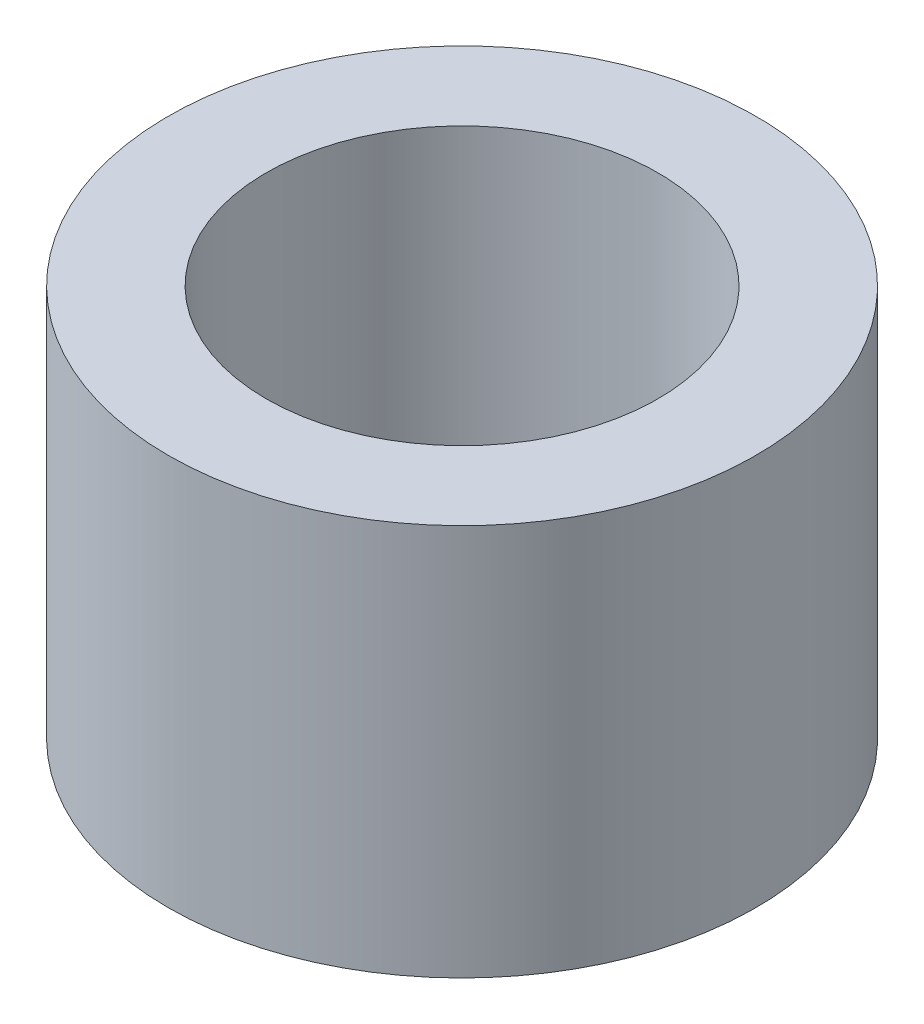
ISO-10303-21;
HEADER;
FILE_DESCRIPTION(('STEP AP214'),'2;1');
FILE_NAME('part.step','',(''),(''),'','','');
FILE_SCHEMA(('AUTOMOTIVE_DESIGN { 1 0 10303 214 1 1 1 1 }'));
ENDSEC;
DATA;
#1=APPLICATION_CONTEXT('core data for automotive mechanical design processes');
#2=APPLICATION_PROTOCOL_DEFINITION('international standard','automotive_design',2000,#1);
#3=PRODUCT_CONTEXT('',#1,'mechanical');
#4=PRODUCT('Part','Part','',(#3));
#5=PRODUCT_RELATED_PRODUCT_CATEGORY('part','',(#4));
#6=PRODUCT_DEFINITION_FORMATION('','',#4);
#7=PRODUCT_DEFINITION_CONTEXT('part definition',#1,'design');
#8=PRODUCT_DEFINITION('design','',#6,#7);
#9=PRODUCT_DEFINITION_SHAPE('','',#8);
#10=(LENGTH_UNIT() NAMED_UNIT(*) SI_UNIT(.MILLI.,.METRE.));
#11=(NAMED_UNIT(*) PLANE_ANGLE_UNIT() SI_UNIT($,.RADIAN.));
#12=(NAMED_UNIT(*) SI_UNIT($,.STERADIAN.) SOLID_ANGLE_UNIT());
#13=UNCERTAINTY_MEASURE_WITH_UNIT(LENGTH_MEASURE(1.E-05),#10,'distance_accuracy_value','');
#14=(GEOMETRIC_REPRESENTATION_CONTEXT(3) GLOBAL_UNCERTAINTY_ASSIGNED_CONTEXT((#13)) GLOBAL_UNIT_ASSIGNED_CONTEXT((#10,
#11,#12)) REPRESENTATION_CONTEXT('',''));
#15=CARTESIAN_POINT('',(0.,0.,0.));
#16=DIRECTION('',(0.,0.,1.));
#17=DIRECTION('',(1.,0.,0.));
#18=AXIS2_PLACEMENT_3D('',#15,#16,#17);
#19=CARTESIAN_POINT('',(0.,6.,0.));
#20=DIRECTION('',(0.,1.,0.));
#21=DIRECTION('',(0.,0.,1.));
#22=AXIS2_PLACEMENT_3D('',#19,#20,#21);
#23=PLANE('',#22);
#24=CARTESIAN_POINT('',(0.,6.,0.));
#25=DIRECTION('',(0.,1.,0.));
#26=DIRECTION('',(0.,0.,1.));
#27=AXIS2_PLACEMENT_3D('',#24,#25,#26);
#28=CIRCLE('',#27,4.5);
#29=CARTESIAN_POINT('',(0.,6.,4.5));
#30=VERTEX_POINT('',#29);
#31=EDGE_CURVE('E10',#30,#30,#28,.T.);
#32=ORIENTED_EDGE('',*,*,#31,.T.);
#33=EDGE_LOOP('',(#32));
#34=FACE_BOUND('',#33,.T.);
#35=CARTESIAN_POINT('',(0.,6.,0.));
#36=DIRECTION('',(0.,1.,0.));
#37=DIRECTION('',(0.,0.,1.));
#38=AXIS2_PLACEMENT_3D('',#35,#36,#37);
#39=CIRCLE('',#38,3.);
#40=CARTESIAN_POINT('',(0.,6.,3.));
#41=VERTEX_POINT('',#40);
#42=EDGE_CURVE('E46',#41,#41,#39,.T.);
#43=ORIENTED_EDGE('',*,*,#42,.F.);
#44=EDGE_LOOP('',(#43));
#45=FACE_BOUND('',#44,.T.);
#46=ADVANCED_FACE('F35',(#34,#45),#23,.T.);
#47=CARTESIAN_POINT('',(0.,0.,0.));
#48=DIRECTION('',(0.,1.,0.));
#49=DIRECTION('',(0.,0.,1.));
#50=AXIS2_PLACEMENT_3D('',#47,#48,#49);
#51=PLANE('',#50);
#52=CARTESIAN_POINT('',(0.,0.,0.));
#53=DIRECTION('',(0.,1.,0.));
#54=DIRECTION('',(0.,0.,1.));
#55=AXIS2_PLACEMENT_3D('',#52,#53,#54);
#56=CIRCLE('',#55,4.5);
#57=CARTESIAN_POINT('',(0.,0.,4.5));
#58=VERTEX_POINT('',#57);
#59=EDGE_CURVE('E39',#58,#58,#56,.T.);
#60=ORIENTED_EDGE('',*,*,#59,.F.);
#61=EDGE_LOOP('',(#60));
#62=FACE_BOUND('',#61,.T.);
#63=CARTESIAN_POINT('',(0.,0.,0.));
#64=DIRECTION('',(0.,1.,0.));
#65=DIRECTION('',(0.,0.,1.));
#66=AXIS2_PLACEMENT_3D('',#63,#64,#65);
#67=CIRCLE('',#66,3.);
#68=CARTESIAN_POINT('',(0.,0.,3.));
#69=VERTEX_POINT('',#68);
#70=EDGE_CURVE('E48',#69,#69,#67,.T.);
#71=ORIENTED_EDGE('',*,*,#70,.T.);
#72=EDGE_LOOP('',(#71));
#73=FACE_BOUND('',#72,.T.);
#74=ADVANCED_FACE('F58',(#62,#73),#51,.F.);
#75=CARTESIAN_POINT('',(0.,6.,0.));
#76=DIRECTION('',(0.,-1.,0.));
#77=DIRECTION('',(0.,0.,-1.));
#78=AXIS2_PLACEMENT_3D('',#75,#76,#77);
#79=CYLINDRICAL_SURFACE('',#78,4.5);
#80=ORIENTED_EDGE('',*,*,#31,.F.);
#81=EDGE_LOOP('',(#80));
#82=FACE_BOUND('',#81,.T.);
#83=ORIENTED_EDGE('',*,*,#59,.T.);
#84=EDGE_LOOP('',(#83));
#85=FACE_BOUND('',#84,.T.);
#86=ADVANCED_FACE('F37',(#82,#85),#79,.T.);
#87=CARTESIAN_POINT('',(0.,6.,0.));
#88=DIRECTION('',(0.,-1.,0.));
#89=DIRECTION('',(0.,0.,-1.));
#90=AXIS2_PLACEMENT_3D('',#87,#88,#89);
#91=CYLINDRICAL_SURFACE('',#90,3.);
#92=ORIENTED_EDGE('',*,*,#42,.T.);
#93=EDGE_LOOP('',(#92));
#94=FACE_BOUND('',#93,.T.);
#95=ORIENTED_EDGE('',*,*,#70,.F.);
#96=EDGE_LOOP('',(#95));
#97=FACE_BOUND('',#96,.T.);
#98=ADVANCED_FACE('F54',(#94,#97),#91,.F.);
#99=CLOSED_SHELL('',(#46,#74,#86,#98));
#100=MANIFOLD_SOLID_BREP('B2',#99);
#101=ADVANCED_BREP_SHAPE_REPRESENTATION('',(#18,#100),#14);
#102=SHAPE_DEFINITION_REPRESENTATION(#9,#101);
ENDSEC;
END-ISO-10303-21;
